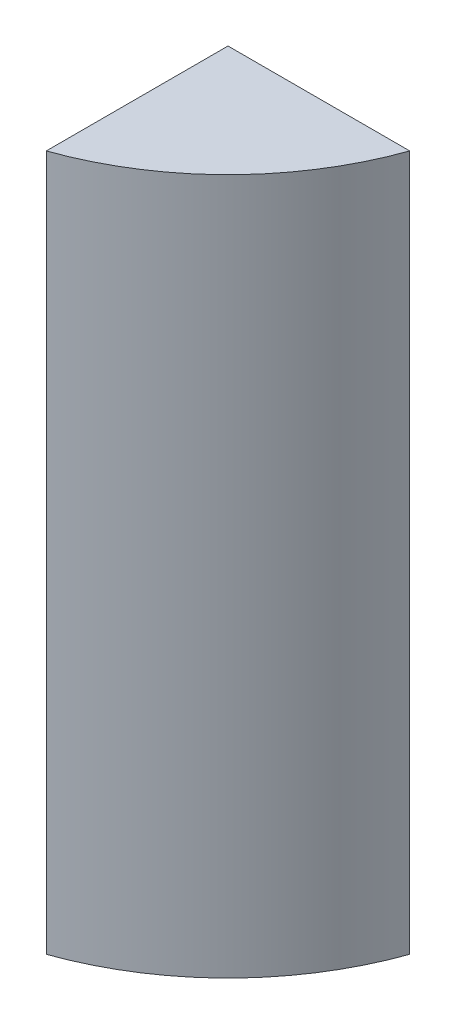
ISO-10303-21;
HEADER;
FILE_DESCRIPTION(('STEP AP214'),'2;1');
FILE_NAME('part.step','',(''),(''),'','','');
FILE_SCHEMA(('AUTOMOTIVE_DESIGN { 1 0 10303 214 1 1 1 1 }'));
ENDSEC;
DATA;
#1=APPLICATION_CONTEXT('core data for automotive mechanical design processes');
#2=APPLICATION_PROTOCOL_DEFINITION('international standard','automotive_design',2000,#1);
#3=PRODUCT_CONTEXT('',#1,'mechanical');
#4=PRODUCT('Part','Part','',(#3));
#5=PRODUCT_RELATED_PRODUCT_CATEGORY('part','',(#4));
#6=PRODUCT_DEFINITION_FORMATION('','',#4);
#7=PRODUCT_DEFINITION_CONTEXT('part definition',#1,'design');
#8=PRODUCT_DEFINITION('design','',#6,#7);
#9=PRODUCT_DEFINITION_SHAPE('','',#8);
#10=(LENGTH_UNIT() NAMED_UNIT(*) SI_UNIT(.MILLI.,.METRE.));
#11=(NAMED_UNIT(*) PLANE_ANGLE_UNIT() SI_UNIT($,.RADIAN.));
#12=(NAMED_UNIT(*) SI_UNIT($,.STERADIAN.) SOLID_ANGLE_UNIT());
#13=UNCERTAINTY_MEASURE_WITH_UNIT(LENGTH_MEASURE(1.E-05),#10,'distance_accuracy_value','');
#14=(GEOMETRIC_REPRESENTATION_CONTEXT(3) GLOBAL_UNCERTAINTY_ASSIGNED_CONTEXT((#13)) GLOBAL_UNIT_ASSIGNED_CONTEXT((#10,
#11,#12)) REPRESENTATION_CONTEXT('',''));
#15=CARTESIAN_POINT('',(0.,0.,0.));
#16=DIRECTION('',(0.,0.,1.));
#17=DIRECTION('',(1.,0.,0.));
#18=AXIS2_PLACEMENT_3D('',#15,#16,#17);
#19=CARTESIAN_POINT('',(20.,140.,0.));
#20=DIRECTION('',(1.,0.,0.));
#21=DIRECTION('',(0.,0.,-1.));
#22=AXIS2_PLACEMENT_3D('',#19,#20,#21);
#23=PLANE('',#22);
#24=DIRECTION('',(0.,0.,1.));
#25=VECTOR('',#24,1.);
#26=CARTESIAN_POINT('',(20.,0.,0.));
#27=LINE('',#26,#25);
#28=CARTESIAN_POINT('',(20.,0.,20.));
#29=VERTEX_POINT('',#28);
#30=CARTESIAN_POINT('',(20.,0.,56.5685424949238));
#31=VERTEX_POINT('',#30);
#32=EDGE_CURVE('E83',#29,#31,#27,.T.);
#33=ORIENTED_EDGE('',*,*,#32,.T.);
#34=DIRECTION('',(0.,-1.,0.));
#35=VECTOR('',#34,1.);
#36=CARTESIAN_POINT('',(20.,140.,56.5685424949238));
#37=LINE('',#36,#35);
#38=CARTESIAN_POINT('',(20.,140.,56.5685424949238));
#39=VERTEX_POINT('',#38);
#40=EDGE_CURVE('E11',#39,#31,#37,.T.);
#41=ORIENTED_EDGE('',*,*,#40,.F.);
#42=DIRECTION('',(0.,0.,1.));
#43=VECTOR('',#42,1.);
#44=CARTESIAN_POINT('',(20.,140.,0.));
#45=LINE('',#44,#43);
#46=CARTESIAN_POINT('',(20.,140.,20.));
#47=VERTEX_POINT('',#46);
#48=EDGE_CURVE('E78',#47,#39,#45,.T.);
#49=ORIENTED_EDGE('',*,*,#48,.F.);
#50=DIRECTION('',(0.,-1.,0.));
#51=VECTOR('',#50,1.);
#52=CARTESIAN_POINT('',(20.,140.,20.));
#53=LINE('',#52,#51);
#54=EDGE_CURVE('E53',#47,#29,#53,.T.);
#55=ORIENTED_EDGE('',*,*,#54,.T.);
#56=EDGE_LOOP('',(#33,#41,#49,#55));
#57=FACE_BOUND('',#56,.T.);
#58=ADVANCED_FACE('F37',(#57),#23,.F.);
#59=CARTESIAN_POINT('',(0.,140.,0.));
#60=DIRECTION('',(0.,-1.,0.));
#61=DIRECTION('',(0.,0.,-1.));
#62=AXIS2_PLACEMENT_3D('',#59,#60,#61);
#63=CYLINDRICAL_SURFACE('',#62,60.);
#64=CARTESIAN_POINT('',(0.,0.,0.));
#65=DIRECTION('',(0.,1.,0.));
#66=DIRECTION('',(0.,0.,1.));
#67=AXIS2_PLACEMENT_3D('',#64,#65,#66);
#68=CIRCLE('',#67,60.);
#69=CARTESIAN_POINT('',(56.5685424949238,0.,20.));
#70=VERTEX_POINT('',#69);
#71=EDGE_CURVE('E86',#31,#70,#68,.T.);
#72=ORIENTED_EDGE('',*,*,#71,.T.);
#73=DIRECTION('',(0.,-1.,0.));
#74=VECTOR('',#73,1.);
#75=CARTESIAN_POINT('',(56.5685424949238,140.,20.));
#76=LINE('',#75,#74);
#77=CARTESIAN_POINT('',(56.5685424949238,140.,20.));
#78=VERTEX_POINT('',#77);
#79=EDGE_CURVE('E45',#78,#70,#76,.T.);
#80=ORIENTED_EDGE('',*,*,#79,.F.);
#81=CARTESIAN_POINT('',(0.,140.,0.));
#82=DIRECTION('',(0.,1.,0.));
#83=DIRECTION('',(0.,0.,1.));
#84=AXIS2_PLACEMENT_3D('',#81,#82,#83);
#85=CIRCLE('',#84,60.);
#86=EDGE_CURVE('E71',#39,#78,#85,.T.);
#87=ORIENTED_EDGE('',*,*,#86,.F.);
#88=ORIENTED_EDGE('',*,*,#40,.T.);
#89=EDGE_LOOP('',(#72,#80,#87,#88));
#90=FACE_BOUND('',#89,.T.);
#91=ADVANCED_FACE('F73',(#90),#63,.T.);
#92=CARTESIAN_POINT('',(0.,140.,20.));
#93=DIRECTION('',(0.,0.,-1.));
#94=DIRECTION('',(-1.,0.,0.));
#95=AXIS2_PLACEMENT_3D('',#92,#93,#94);
#96=PLANE('',#95);
#97=DIRECTION('',(1.,0.,0.));
#98=VECTOR('',#97,1.);
#99=CARTESIAN_POINT('',(0.,0.,20.));
#100=LINE('',#99,#98);
#101=EDGE_CURVE('E81',#29,#70,#100,.T.);
#102=ORIENTED_EDGE('',*,*,#101,.F.);
#103=ORIENTED_EDGE('',*,*,#54,.F.);
#104=DIRECTION('',(1.,0.,0.));
#105=VECTOR('',#104,1.);
#106=CARTESIAN_POINT('',(0.,140.,20.));
#107=LINE('',#106,#105);
#108=EDGE_CURVE('E77',#47,#78,#107,.T.);
#109=ORIENTED_EDGE('',*,*,#108,.T.);
#110=ORIENTED_EDGE('',*,*,#79,.T.);
#111=EDGE_LOOP('',(#102,#103,#109,#110));
#112=FACE_BOUND('',#111,.T.);
#113=ADVANCED_FACE('F92',(#112),#96,.T.);
#114=CARTESIAN_POINT('',(0.,140.,0.));
#115=DIRECTION('',(0.,1.,0.));
#116=DIRECTION('',(0.,0.,1.));
#117=AXIS2_PLACEMENT_3D('',#114,#115,#116);
#118=PLANE('',#117);
#119=ORIENTED_EDGE('',*,*,#48,.T.);
#120=ORIENTED_EDGE('',*,*,#86,.T.);
#121=ORIENTED_EDGE('',*,*,#108,.F.);
#122=EDGE_LOOP('',(#119,#120,#121));
#123=FACE_BOUND('',#122,.T.);
#124=ADVANCED_FACE('F80',(#123),#118,.T.);
#125=CARTESIAN_POINT('',(0.,0.,0.));
#126=DIRECTION('',(0.,1.,0.));
#127=DIRECTION('',(0.,0.,1.));
#128=AXIS2_PLACEMENT_3D('',#125,#126,#127);
#129=PLANE('',#128);
#130=ORIENTED_EDGE('',*,*,#32,.F.);
#131=ORIENTED_EDGE('',*,*,#101,.T.);
#132=ORIENTED_EDGE('',*,*,#71,.F.);
#133=EDGE_LOOP('',(#130,#131,#132));
#134=FACE_BOUND('',#133,.T.);
#135=ADVANCED_FACE('F99',(#134),#129,.F.);
#136=CLOSED_SHELL('',(#58,#91,#113,#124,#135));
#137=MANIFOLD_SOLID_BREP('B2',#136);
#138=ADVANCED_BREP_SHAPE_REPRESENTATION('',(#18,#137),#14);
#139=SHAPE_DEFINITION_REPRESENTATION(#9,#138);
ENDSEC;
END-ISO-10303-21;
